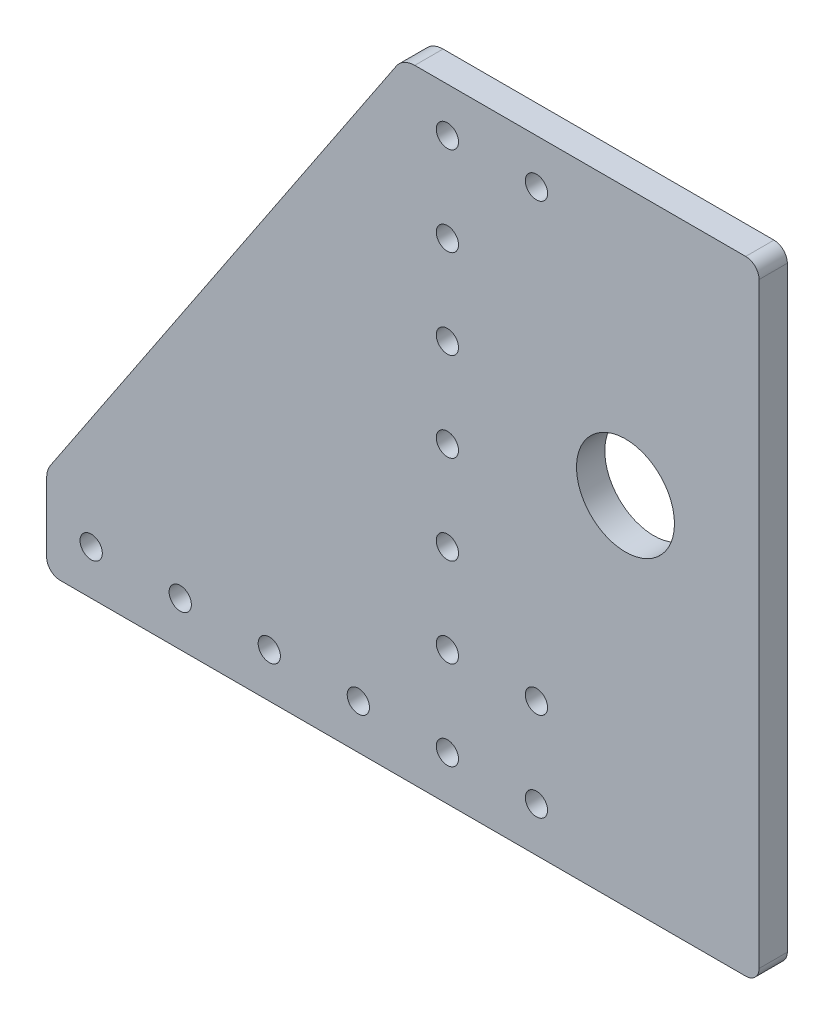
ISO-10303-21;
HEADER;
FILE_DESCRIPTION(('STEP AP214'),'2;1');
FILE_NAME('part.step','',(''),(''),'','','');
FILE_SCHEMA(('AUTOMOTIVE_DESIGN { 1 0 10303 214 1 1 1 1 }'));
ENDSEC;
DATA;
#1=APPLICATION_CONTEXT('core data for automotive mechanical design processes');
#2=APPLICATION_PROTOCOL_DEFINITION('international standard','automotive_design',2000,#1);
#3=PRODUCT_CONTEXT('',#1,'mechanical');
#4=PRODUCT('Part','Part','',(#3));
#5=PRODUCT_RELATED_PRODUCT_CATEGORY('part','',(#4));
#6=PRODUCT_DEFINITION_FORMATION('','',#4);
#7=PRODUCT_DEFINITION_CONTEXT('part definition',#1,'design');
#8=PRODUCT_DEFINITION('design','',#6,#7);
#9=PRODUCT_DEFINITION_SHAPE('','',#8);
#10=(LENGTH_UNIT() NAMED_UNIT(*) SI_UNIT(.MILLI.,.METRE.));
#11=(NAMED_UNIT(*) PLANE_ANGLE_UNIT() SI_UNIT($,.RADIAN.));
#12=(NAMED_UNIT(*) SI_UNIT($,.STERADIAN.) SOLID_ANGLE_UNIT());
#13=UNCERTAINTY_MEASURE_WITH_UNIT(LENGTH_MEASURE(1.E-05),#10,'distance_accuracy_value','');
#14=(GEOMETRIC_REPRESENTATION_CONTEXT(3) GLOBAL_UNCERTAINTY_ASSIGNED_CONTEXT((#13)) GLOBAL_UNIT_ASSIGNED_CONTEXT((#10,
#11,#12)) REPRESENTATION_CONTEXT('',''));
#15=CARTESIAN_POINT('',(0.,0.,0.));
#16=DIRECTION('',(0.,0.,1.));
#17=DIRECTION('',(1.,0.,0.));
#18=AXIS2_PLACEMENT_3D('',#15,#16,#17);
#19=CARTESIAN_POINT('',(0.,0.,6.35));
#20=DIRECTION('',(0.,0.,1.));
#21=DIRECTION('',(1.,0.,0.));
#22=AXIS2_PLACEMENT_3D('',#19,#20,#21);
#23=PLANE('',#22);
#24=CARTESIAN_POINT('',(-110.,-68.1751824817524,6.35));
#25=DIRECTION('',(0.,0.,1.));
#26=DIRECTION('',(1.,0.,0.));
#27=AXIS2_PLACEMENT_3D('',#24,#25,#26);
#28=CIRCLE('',#27,2.50000000000001);
#29=CARTESIAN_POINT('',(-107.5,-68.1751824817524,6.35));
#30=VERTEX_POINT('',#29);
#31=EDGE_CURVE('E270',#30,#30,#28,.T.);
#32=ORIENTED_EDGE('',*,*,#31,.F.);
#33=EDGE_LOOP('',(#32));
#34=FACE_BOUND('',#33,.T.);
#35=CARTESIAN_POINT('',(-70.,-68.1751824817521,6.35));
#36=DIRECTION('',(0.,0.,1.));
#37=DIRECTION('',(1.,0.,0.));
#38=AXIS2_PLACEMENT_3D('',#35,#36,#37);
#39=CIRCLE('',#38,2.50000000000002);
#40=CARTESIAN_POINT('',(-67.5,-68.1751824817521,6.35));
#41=VERTEX_POINT('',#40);
#42=EDGE_CURVE('E258',#41,#41,#39,.T.);
#43=ORIENTED_EDGE('',*,*,#42,.F.);
#44=EDGE_LOOP('',(#43));
#45=FACE_BOUND('',#44,.T.);
#46=CARTESIAN_POINT('',(-30.,-68.1751824817518,6.35));
#47=DIRECTION('',(0.,0.,1.));
#48=DIRECTION('',(1.,0.,0.));
#49=AXIS2_PLACEMENT_3D('',#46,#47,#48);
#50=CIRCLE('',#49,2.50000000000001);
#51=CARTESIAN_POINT('',(-27.5,-68.1751824817518,6.35));
#52=VERTEX_POINT('',#51);
#53=EDGE_CURVE('E246',#52,#52,#50,.T.);
#54=ORIENTED_EDGE('',*,*,#53,.F.);
#55=EDGE_LOOP('',(#54));
#56=FACE_BOUND('',#55,.T.);
#57=CARTESIAN_POINT('',(-30.0000000000003,51.8248175182482,6.35));
#58=DIRECTION('',(0.,0.,1.));
#59=DIRECTION('',(1.,0.,0.));
#60=AXIS2_PLACEMENT_3D('',#57,#58,#59);
#61=CIRCLE('',#60,2.5);
#62=CARTESIAN_POINT('',(-27.5000000000003,51.8248175182482,6.35));
#63=VERTEX_POINT('',#62);
#64=EDGE_CURVE('E234',#63,#63,#61,.T.);
#65=ORIENTED_EDGE('',*,*,#64,.F.);
#66=EDGE_LOOP('',(#65));
#67=FACE_BOUND('',#66,.T.);
#68=CARTESIAN_POINT('',(-50.0000000000003,51.8248175182482,6.35));
#69=DIRECTION('',(0.,0.,1.));
#70=DIRECTION('',(1.,0.,0.));
#71=AXIS2_PLACEMENT_3D('',#68,#69,#70);
#72=CIRCLE('',#71,2.5);
#73=CARTESIAN_POINT('',(-47.5000000000003,51.8248175182482,6.35));
#74=VERTEX_POINT('',#73);
#75=EDGE_CURVE('E222',#74,#74,#72,.T.);
#76=ORIENTED_EDGE('',*,*,#75,.F.);
#77=EDGE_LOOP('',(#76));
#78=FACE_BOUND('',#77,.T.);
#79=CARTESIAN_POINT('',(-50.0000000000002,11.8248175182482,6.35));
#80=DIRECTION('',(0.,0.,1.));
#81=DIRECTION('',(1.,0.,0.));
#82=AXIS2_PLACEMENT_3D('',#79,#80,#81);
#83=CIRCLE('',#82,2.5);
#84=CARTESIAN_POINT('',(-47.5000000000002,11.8248175182482,6.35));
#85=VERTEX_POINT('',#84);
#86=EDGE_CURVE('E210',#85,#85,#83,.T.);
#87=ORIENTED_EDGE('',*,*,#86,.F.);
#88=EDGE_LOOP('',(#87));
#89=FACE_BOUND('',#88,.T.);
#90=CARTESIAN_POINT('',(-50.,-28.1751824817518,6.35));
#91=DIRECTION('',(0.,0.,1.));
#92=DIRECTION('',(1.,0.,0.));
#93=AXIS2_PLACEMENT_3D('',#90,#91,#92);
#94=CIRCLE('',#93,2.5);
#95=CARTESIAN_POINT('',(-47.5,-28.1751824817518,6.35));
#96=VERTEX_POINT('',#95);
#97=EDGE_CURVE('E198',#96,#96,#94,.T.);
#98=ORIENTED_EDGE('',*,*,#97,.F.);
#99=EDGE_LOOP('',(#98));
#100=FACE_BOUND('',#99,.T.);
#101=DIRECTION('',(1.,0.,0.));
#102=VECTOR('',#101,1.);
#103=CARTESIAN_POINT('',(-140.,-78.1751824817518,6.35));
#104=LINE('',#103,#102);
#105=CARTESIAN_POINT('',(-137.,-78.1751824817518,6.35));
#106=VERTEX_POINT('',#105);
#107=CARTESIAN_POINT('',(17.,-78.1751824817518,6.35));
#108=VERTEX_POINT('',#107);
#109=EDGE_CURVE('E126',#106,#108,#104,.T.);
#110=ORIENTED_EDGE('',*,*,#109,.T.);
#111=CARTESIAN_POINT('',(17.,-75.1751824817518,6.35));
#112=DIRECTION('',(0.,0.,1.));
#113=DIRECTION('',(1.,0.,0.));
#114=AXIS2_PLACEMENT_3D('',#111,#112,#113);
#115=CIRCLE('',#114,3.);
#116=CARTESIAN_POINT('',(20.,-75.1751824817518,6.35));
#117=VERTEX_POINT('',#116);
#118=EDGE_CURVE('E173',#108,#117,#115,.T.);
#119=ORIENTED_EDGE('',*,*,#118,.T.);
#120=DIRECTION('',(0.,1.,0.));
#121=VECTOR('',#120,1.);
#122=CARTESIAN_POINT('',(20.,-78.1751824817518,6.35));
#123=LINE('',#122,#121);
#124=CARTESIAN_POINT('',(20.,58.8248175182482,6.35));
#125=VERTEX_POINT('',#124);
#126=EDGE_CURVE('E137',#117,#125,#123,.T.);
#127=ORIENTED_EDGE('',*,*,#126,.T.);
#128=CARTESIAN_POINT('',(17.,58.8248175182482,6.35));
#129=DIRECTION('',(0.,0.,1.));
#130=DIRECTION('',(1.,0.,0.));
#131=AXIS2_PLACEMENT_3D('',#128,#129,#130);
#132=CIRCLE('',#131,3.);
#133=CARTESIAN_POINT('',(17.,61.8248175182482,6.35));
#134=VERTEX_POINT('',#133);
#135=EDGE_CURVE('E47',#125,#134,#132,.T.);
#136=ORIENTED_EDGE('',*,*,#135,.T.);
#137=DIRECTION('',(-1.,0.,0.));
#138=VECTOR('',#137,1.);
#139=CARTESIAN_POINT('',(20.,61.8248175182482,6.35));
#140=LINE('',#139,#138);
#141=CARTESIAN_POINT('',(-57.32408120756,61.8248175182482,6.35));
#142=VERTEX_POINT('',#141);
#143=EDGE_CURVE('E179',#134,#142,#140,.T.);
#144=ORIENTED_EDGE('',*,*,#143,.T.);
#145=CARTESIAN_POINT('',(-57.32408120756,56.8248175182482,6.35));
#146=DIRECTION('',(0.,0.,1.));
#147=DIRECTION('',(1.,0.,0.));
#148=AXIS2_PLACEMENT_3D('',#145,#146,#147);
#149=CIRCLE('',#148,5.);
#150=CARTESIAN_POINT('',(-61.4843326792492,59.5983184993743,6.35));
#151=VERTEX_POINT('',#150);
#152=EDGE_CURVE('E148',#142,#151,#149,.T.);
#153=ORIENTED_EDGE('',*,*,#152,.T.);
#154=DIRECTION('',(-0.554700196225227,-0.832050294337845,0.));
#155=VECTOR('',#154,1.);
#156=CARTESIAN_POINT('',(-140.,-58.1751824817518,6.35));
#157=LINE('',#156,#155);
#158=CARTESIAN_POINT('',(-139.160251471689,-56.9155596892856,6.35));
#159=VERTEX_POINT('',#158);
#160=EDGE_CURVE('E190',#151,#159,#157,.T.);
#161=ORIENTED_EDGE('',*,*,#160,.T.);
#162=CARTESIAN_POINT('',(-135.,-59.6890606704118,6.35));
#163=DIRECTION('',(0.,0.,1.));
#164=DIRECTION('',(1.,0.,0.));
#165=AXIS2_PLACEMENT_3D('',#162,#163,#164);
#166=CIRCLE('',#165,5.);
#167=CARTESIAN_POINT('',(-140.,-59.6890606704118,6.35));
#168=VERTEX_POINT('',#167);
#169=EDGE_CURVE('E150',#159,#168,#166,.T.);
#170=ORIENTED_EDGE('',*,*,#169,.T.);
#171=DIRECTION('',(0.,-1.,0.));
#172=VECTOR('',#171,1.);
#173=CARTESIAN_POINT('',(-140.,-78.1751824817518,6.35));
#174=LINE('',#173,#172);
#175=CARTESIAN_POINT('',(-140.,-75.1751824817518,6.35));
#176=VERTEX_POINT('',#175);
#177=EDGE_CURVE('E125',#168,#176,#174,.T.);
#178=ORIENTED_EDGE('',*,*,#177,.T.);
#179=CARTESIAN_POINT('',(-137.,-75.1751824817518,6.35));
#180=DIRECTION('',(0.,0.,1.));
#181=DIRECTION('',(1.,0.,0.));
#182=AXIS2_PLACEMENT_3D('',#179,#180,#181);
#183=CIRCLE('',#182,3.);
#184=EDGE_CURVE('E170',#176,#106,#183,.T.);
#185=ORIENTED_EDGE('',*,*,#184,.T.);
#186=EDGE_LOOP('',(#110,#119,#127,#136,#144,#153,#161,#170,#178,#185));
#187=FACE_BOUND('',#186,.T.);
#188=CARTESIAN_POINT('',(-50.,-48.1751824817518,6.35));
#189=DIRECTION('',(0.,0.,1.));
#190=DIRECTION('',(1.,0.,0.));
#191=AXIS2_PLACEMENT_3D('',#188,#189,#190);
#192=CIRCLE('',#191,2.5);
#193=CARTESIAN_POINT('',(-47.5,-48.1751824817518,6.35));
#194=VERTEX_POINT('',#193);
#195=EDGE_CURVE('E184',#194,#194,#192,.T.);
#196=ORIENTED_EDGE('',*,*,#195,.F.);
#197=EDGE_LOOP('',(#196));
#198=FACE_BOUND('',#197,.T.);
#199=CARTESIAN_POINT('',(-50.0000000000001,-8.17518248175182,6.35));
#200=DIRECTION('',(0.,0.,1.));
#201=DIRECTION('',(1.,0.,0.));
#202=AXIS2_PLACEMENT_3D('',#199,#200,#201);
#203=CIRCLE('',#202,2.5);
#204=CARTESIAN_POINT('',(-47.5000000000001,-8.17518248175182,6.35));
#205=VERTEX_POINT('',#204);
#206=EDGE_CURVE('E204',#205,#205,#203,.T.);
#207=ORIENTED_EDGE('',*,*,#206,.F.);
#208=EDGE_LOOP('',(#207));
#209=FACE_BOUND('',#208,.T.);
#210=CARTESIAN_POINT('',(-50.0000000000003,31.8248175182482,6.35));
#211=DIRECTION('',(0.,0.,1.));
#212=DIRECTION('',(1.,0.,0.));
#213=AXIS2_PLACEMENT_3D('',#210,#211,#212);
#214=CIRCLE('',#213,2.5);
#215=CARTESIAN_POINT('',(-47.5000000000002,31.8248175182482,6.35));
#216=VERTEX_POINT('',#215);
#217=EDGE_CURVE('E216',#216,#216,#214,.T.);
#218=ORIENTED_EDGE('',*,*,#217,.F.);
#219=EDGE_LOOP('',(#218));
#220=FACE_BOUND('',#219,.T.);
#221=CARTESIAN_POINT('',(-30.,-48.1751824817518,6.35));
#222=DIRECTION('',(0.,0.,1.));
#223=DIRECTION('',(1.,0.,0.));
#224=AXIS2_PLACEMENT_3D('',#221,#222,#223);
#225=CIRCLE('',#224,2.5);
#226=CARTESIAN_POINT('',(-27.5,-48.1751824817518,6.35));
#227=VERTEX_POINT('',#226);
#228=EDGE_CURVE('E228',#227,#227,#225,.T.);
#229=ORIENTED_EDGE('',*,*,#228,.F.);
#230=EDGE_LOOP('',(#229));
#231=FACE_BOUND('',#230,.T.);
#232=CARTESIAN_POINT('',(-9.99999999999999,1.82481751824847,6.35));
#233=DIRECTION('',(0.,0.,1.));
#234=DIRECTION('',(1.,0.,0.));
#235=AXIS2_PLACEMENT_3D('',#232,#233,#234);
#236=CIRCLE('',#235,10.9999999999999);
#237=CARTESIAN_POINT('',(0.999999999999925,1.82481751824847,6.35));
#238=VERTEX_POINT('',#237);
#239=EDGE_CURVE('E240',#238,#238,#236,.T.);
#240=ORIENTED_EDGE('',*,*,#239,.F.);
#241=EDGE_LOOP('',(#240));
#242=FACE_BOUND('',#241,.T.);
#243=CARTESIAN_POINT('',(-50.,-68.1751824817519,6.35));
#244=DIRECTION('',(0.,0.,1.));
#245=DIRECTION('',(1.,0.,0.));
#246=AXIS2_PLACEMENT_3D('',#243,#244,#245);
#247=CIRCLE('',#246,2.50000000000001);
#248=CARTESIAN_POINT('',(-47.5,-68.1751824817519,6.35));
#249=VERTEX_POINT('',#248);
#250=EDGE_CURVE('E252',#249,#249,#247,.T.);
#251=ORIENTED_EDGE('',*,*,#250,.F.);
#252=EDGE_LOOP('',(#251));
#253=FACE_BOUND('',#252,.T.);
#254=CARTESIAN_POINT('',(-90.,-68.1751824817522,6.35));
#255=DIRECTION('',(0.,0.,1.));
#256=DIRECTION('',(1.,0.,0.));
#257=AXIS2_PLACEMENT_3D('',#254,#255,#256);
#258=CIRCLE('',#257,2.50000000000001);
#259=CARTESIAN_POINT('',(-87.5,-68.1751824817522,6.35));
#260=VERTEX_POINT('',#259);
#261=EDGE_CURVE('E264',#260,#260,#258,.T.);
#262=ORIENTED_EDGE('',*,*,#261,.F.);
#263=EDGE_LOOP('',(#262));
#264=FACE_BOUND('',#263,.T.);
#265=CARTESIAN_POINT('',(-130.,-68.1751824817525,6.35));
#266=DIRECTION('',(0.,0.,1.));
#267=DIRECTION('',(1.,0.,0.));
#268=AXIS2_PLACEMENT_3D('',#265,#266,#267);
#269=CIRCLE('',#268,2.5);
#270=CARTESIAN_POINT('',(-127.5,-68.1751824817525,6.35));
#271=VERTEX_POINT('',#270);
#272=EDGE_CURVE('E276',#271,#271,#269,.T.);
#273=ORIENTED_EDGE('',*,*,#272,.F.);
#274=EDGE_LOOP('',(#273));
#275=FACE_BOUND('',#274,.T.);
#276=ADVANCED_FACE('F32',(#34,#45,#56,#67,#78,#89,#100,#187,#198,#209,#220,#231,#242,#253,#264,
#275),#23,.T.);
#277=CARTESIAN_POINT('',(0.,0.,0.));
#278=DIRECTION('',(0.,0.,1.));
#279=DIRECTION('',(1.,0.,0.));
#280=AXIS2_PLACEMENT_3D('',#277,#278,#279);
#281=PLANE('',#280);
#282=DIRECTION('',(0.,1.,0.));
#283=VECTOR('',#282,1.);
#284=CARTESIAN_POINT('',(20.,-78.1751824817518,0.));
#285=LINE('',#284,#283);
#286=CARTESIAN_POINT('',(20.,-75.1751824817518,0.));
#287=VERTEX_POINT('',#286);
#288=CARTESIAN_POINT('',(20.,58.8248175182482,0.));
#289=VERTEX_POINT('',#288);
#290=EDGE_CURVE('E183',#287,#289,#285,.T.);
#291=ORIENTED_EDGE('',*,*,#290,.F.);
#292=CARTESIAN_POINT('',(17.,-75.1751824817518,0.));
#293=DIRECTION('',(0.,0.,1.));
#294=DIRECTION('',(1.,0.,0.));
#295=AXIS2_PLACEMENT_3D('',#292,#293,#294);
#296=CIRCLE('',#295,3.);
#297=CARTESIAN_POINT('',(17.,-78.1751824817518,0.));
#298=VERTEX_POINT('',#297);
#299=EDGE_CURVE('E163',#287,#298,#296,.F.);
#300=ORIENTED_EDGE('',*,*,#299,.T.);
#301=DIRECTION('',(1.,0.,0.));
#302=VECTOR('',#301,1.);
#303=CARTESIAN_POINT('',(-140.,-78.1751824817518,0.));
#304=LINE('',#303,#302);
#305=CARTESIAN_POINT('',(-137.,-78.1751824817518,0.));
#306=VERTEX_POINT('',#305);
#307=EDGE_CURVE('E133',#306,#298,#304,.T.);
#308=ORIENTED_EDGE('',*,*,#307,.F.);
#309=CARTESIAN_POINT('',(-137.,-75.1751824817518,0.));
#310=DIRECTION('',(0.,0.,1.));
#311=DIRECTION('',(1.,0.,0.));
#312=AXIS2_PLACEMENT_3D('',#309,#310,#311);
#313=CIRCLE('',#312,3.);
#314=CARTESIAN_POINT('',(-140.,-75.1751824817518,0.));
#315=VERTEX_POINT('',#314);
#316=EDGE_CURVE('E132',#306,#315,#313,.F.);
#317=ORIENTED_EDGE('',*,*,#316,.T.);
#318=DIRECTION('',(0.,-1.,0.));
#319=VECTOR('',#318,1.);
#320=CARTESIAN_POINT('',(-140.,-78.1751824817518,0.));
#321=LINE('',#320,#319);
#322=CARTESIAN_POINT('',(-140.,-59.6890606704118,0.));
#323=VERTEX_POINT('',#322);
#324=EDGE_CURVE('E124',#323,#315,#321,.T.);
#325=ORIENTED_EDGE('',*,*,#324,.F.);
#326=CARTESIAN_POINT('',(-135.,-59.6890606704118,0.));
#327=DIRECTION('',(0.,0.,1.));
#328=DIRECTION('',(1.,0.,0.));
#329=AXIS2_PLACEMENT_3D('',#326,#327,#328);
#330=CIRCLE('',#329,5.);
#331=CARTESIAN_POINT('',(-139.160251471689,-56.9155596892856,0.));
#332=VERTEX_POINT('',#331);
#333=EDGE_CURVE('E110',#323,#332,#330,.F.);
#334=ORIENTED_EDGE('',*,*,#333,.T.);
#335=DIRECTION('',(-0.554700196225227,-0.832050294337845,0.));
#336=VECTOR('',#335,1.);
#337=CARTESIAN_POINT('',(-140.,-58.1751824817518,0.));
#338=LINE('',#337,#336);
#339=CARTESIAN_POINT('',(-61.4843326792492,59.5983184993743,0.));
#340=VERTEX_POINT('',#339);
#341=EDGE_CURVE('E134',#340,#332,#338,.T.);
#342=ORIENTED_EDGE('',*,*,#341,.F.);
#343=CARTESIAN_POINT('',(-57.32408120756,56.8248175182482,0.));
#344=DIRECTION('',(0.,0.,1.));
#345=DIRECTION('',(1.,0.,0.));
#346=AXIS2_PLACEMENT_3D('',#343,#344,#345);
#347=CIRCLE('',#346,5.);
#348=CARTESIAN_POINT('',(-57.32408120756,61.8248175182482,0.));
#349=VERTEX_POINT('',#348);
#350=EDGE_CURVE('E121',#340,#349,#347,.F.);
#351=ORIENTED_EDGE('',*,*,#350,.T.);
#352=DIRECTION('',(-1.,0.,0.));
#353=VECTOR('',#352,1.);
#354=CARTESIAN_POINT('',(20.,61.8248175182482,0.));
#355=LINE('',#354,#353);
#356=CARTESIAN_POINT('',(17.,61.8248175182482,0.));
#357=VERTEX_POINT('',#356);
#358=EDGE_CURVE('E139',#357,#349,#355,.T.);
#359=ORIENTED_EDGE('',*,*,#358,.F.);
#360=CARTESIAN_POINT('',(17.,58.8248175182482,0.));
#361=DIRECTION('',(0.,0.,1.));
#362=DIRECTION('',(1.,0.,0.));
#363=AXIS2_PLACEMENT_3D('',#360,#361,#362);
#364=CIRCLE('',#363,3.);
#365=EDGE_CURVE('E161',#357,#289,#364,.F.);
#366=ORIENTED_EDGE('',*,*,#365,.T.);
#367=EDGE_LOOP('',(#291,#300,#308,#317,#325,#334,#342,#351,#359,#366));
#368=FACE_BOUND('',#367,.T.);
#369=CARTESIAN_POINT('',(-50.,-48.1751824817518,0.));
#370=DIRECTION('',(0.,0.,1.));
#371=DIRECTION('',(1.,0.,0.));
#372=AXIS2_PLACEMENT_3D('',#369,#370,#371);
#373=CIRCLE('',#372,2.5);
#374=CARTESIAN_POINT('',(-47.5,-48.1751824817518,0.));
#375=VERTEX_POINT('',#374);
#376=EDGE_CURVE('E195',#375,#375,#373,.T.);
#377=ORIENTED_EDGE('',*,*,#376,.T.);
#378=EDGE_LOOP('',(#377));
#379=FACE_BOUND('',#378,.T.);
#380=CARTESIAN_POINT('',(-50.,-28.1751824817518,0.));
#381=DIRECTION('',(0.,0.,1.));
#382=DIRECTION('',(1.,0.,0.));
#383=AXIS2_PLACEMENT_3D('',#380,#381,#382);
#384=CIRCLE('',#383,2.5);
#385=CARTESIAN_POINT('',(-47.5,-28.1751824817518,0.));
#386=VERTEX_POINT('',#385);
#387=EDGE_CURVE('E201',#386,#386,#384,.T.);
#388=ORIENTED_EDGE('',*,*,#387,.T.);
#389=EDGE_LOOP('',(#388));
#390=FACE_BOUND('',#389,.T.);
#391=CARTESIAN_POINT('',(-50.0000000000001,-8.17518248175182,0.));
#392=DIRECTION('',(0.,0.,1.));
#393=DIRECTION('',(1.,0.,0.));
#394=AXIS2_PLACEMENT_3D('',#391,#392,#393);
#395=CIRCLE('',#394,2.5);
#396=CARTESIAN_POINT('',(-47.5000000000001,-8.17518248175182,0.));
#397=VERTEX_POINT('',#396);
#398=EDGE_CURVE('E207',#397,#397,#395,.T.);
#399=ORIENTED_EDGE('',*,*,#398,.T.);
#400=EDGE_LOOP('',(#399));
#401=FACE_BOUND('',#400,.T.);
#402=CARTESIAN_POINT('',(-50.0000000000002,11.8248175182482,0.));
#403=DIRECTION('',(0.,0.,1.));
#404=DIRECTION('',(1.,0.,0.));
#405=AXIS2_PLACEMENT_3D('',#402,#403,#404);
#406=CIRCLE('',#405,2.5);
#407=CARTESIAN_POINT('',(-47.5000000000002,11.8248175182482,0.));
#408=VERTEX_POINT('',#407);
#409=EDGE_CURVE('E213',#408,#408,#406,.T.);
#410=ORIENTED_EDGE('',*,*,#409,.T.);
#411=EDGE_LOOP('',(#410));
#412=FACE_BOUND('',#411,.T.);
#413=CARTESIAN_POINT('',(-50.0000000000003,31.8248175182482,0.));
#414=DIRECTION('',(0.,0.,1.));
#415=DIRECTION('',(1.,0.,0.));
#416=AXIS2_PLACEMENT_3D('',#413,#414,#415);
#417=CIRCLE('',#416,2.5);
#418=CARTESIAN_POINT('',(-47.5000000000002,31.8248175182482,0.));
#419=VERTEX_POINT('',#418);
#420=EDGE_CURVE('E219',#419,#419,#417,.T.);
#421=ORIENTED_EDGE('',*,*,#420,.T.);
#422=EDGE_LOOP('',(#421));
#423=FACE_BOUND('',#422,.T.);
#424=CARTESIAN_POINT('',(-50.0000000000003,51.8248175182482,0.));
#425=DIRECTION('',(0.,0.,1.));
#426=DIRECTION('',(1.,0.,0.));
#427=AXIS2_PLACEMENT_3D('',#424,#425,#426);
#428=CIRCLE('',#427,2.5);
#429=CARTESIAN_POINT('',(-47.5000000000003,51.8248175182482,0.));
#430=VERTEX_POINT('',#429);
#431=EDGE_CURVE('E225',#430,#430,#428,.T.);
#432=ORIENTED_EDGE('',*,*,#431,.T.);
#433=EDGE_LOOP('',(#432));
#434=FACE_BOUND('',#433,.T.);
#435=CARTESIAN_POINT('',(-30.,-48.1751824817518,0.));
#436=DIRECTION('',(0.,0.,1.));
#437=DIRECTION('',(1.,0.,0.));
#438=AXIS2_PLACEMENT_3D('',#435,#436,#437);
#439=CIRCLE('',#438,2.5);
#440=CARTESIAN_POINT('',(-27.5,-48.1751824817518,0.));
#441=VERTEX_POINT('',#440);
#442=EDGE_CURVE('E231',#441,#441,#439,.T.);
#443=ORIENTED_EDGE('',*,*,#442,.T.);
#444=EDGE_LOOP('',(#443));
#445=FACE_BOUND('',#444,.T.);
#446=CARTESIAN_POINT('',(-30.0000000000003,51.8248175182482,0.));
#447=DIRECTION('',(0.,0.,1.));
#448=DIRECTION('',(1.,0.,0.));
#449=AXIS2_PLACEMENT_3D('',#446,#447,#448);
#450=CIRCLE('',#449,2.5);
#451=CARTESIAN_POINT('',(-27.5000000000003,51.8248175182482,0.));
#452=VERTEX_POINT('',#451);
#453=EDGE_CURVE('E237',#452,#452,#450,.T.);
#454=ORIENTED_EDGE('',*,*,#453,.T.);
#455=EDGE_LOOP('',(#454));
#456=FACE_BOUND('',#455,.T.);
#457=CARTESIAN_POINT('',(-9.99999999999999,1.82481751824847,0.));
#458=DIRECTION('',(0.,0.,1.));
#459=DIRECTION('',(1.,0.,0.));
#460=AXIS2_PLACEMENT_3D('',#457,#458,#459);
#461=CIRCLE('',#460,10.9999999999999);
#462=CARTESIAN_POINT('',(0.999999999999925,1.82481751824847,0.));
#463=VERTEX_POINT('',#462);
#464=EDGE_CURVE('E243',#463,#463,#461,.T.);
#465=ORIENTED_EDGE('',*,*,#464,.T.);
#466=EDGE_LOOP('',(#465));
#467=FACE_BOUND('',#466,.T.);
#468=CARTESIAN_POINT('',(-30.,-68.1751824817518,0.));
#469=DIRECTION('',(0.,0.,1.));
#470=DIRECTION('',(1.,0.,0.));
#471=AXIS2_PLACEMENT_3D('',#468,#469,#470);
#472=CIRCLE('',#471,2.50000000000001);
#473=CARTESIAN_POINT('',(-27.5,-68.1751824817518,0.));
#474=VERTEX_POINT('',#473);
#475=EDGE_CURVE('E249',#474,#474,#472,.T.);
#476=ORIENTED_EDGE('',*,*,#475,.T.);
#477=EDGE_LOOP('',(#476));
#478=FACE_BOUND('',#477,.T.);
#479=CARTESIAN_POINT('',(-50.,-68.1751824817519,0.));
#480=DIRECTION('',(0.,0.,1.));
#481=DIRECTION('',(1.,0.,0.));
#482=AXIS2_PLACEMENT_3D('',#479,#480,#481);
#483=CIRCLE('',#482,2.50000000000001);
#484=CARTESIAN_POINT('',(-47.5,-68.1751824817519,0.));
#485=VERTEX_POINT('',#484);
#486=EDGE_CURVE('E255',#485,#485,#483,.T.);
#487=ORIENTED_EDGE('',*,*,#486,.T.);
#488=EDGE_LOOP('',(#487));
#489=FACE_BOUND('',#488,.T.);
#490=CARTESIAN_POINT('',(-70.,-68.1751824817521,0.));
#491=DIRECTION('',(0.,0.,1.));
#492=DIRECTION('',(1.,0.,0.));
#493=AXIS2_PLACEMENT_3D('',#490,#491,#492);
#494=CIRCLE('',#493,2.50000000000002);
#495=CARTESIAN_POINT('',(-67.5,-68.1751824817521,0.));
#496=VERTEX_POINT('',#495);
#497=EDGE_CURVE('E261',#496,#496,#494,.T.);
#498=ORIENTED_EDGE('',*,*,#497,.T.);
#499=EDGE_LOOP('',(#498));
#500=FACE_BOUND('',#499,.T.);
#501=CARTESIAN_POINT('',(-90.,-68.1751824817522,0.));
#502=DIRECTION('',(0.,0.,1.));
#503=DIRECTION('',(1.,0.,0.));
#504=AXIS2_PLACEMENT_3D('',#501,#502,#503);
#505=CIRCLE('',#504,2.50000000000001);
#506=CARTESIAN_POINT('',(-87.5,-68.1751824817522,0.));
#507=VERTEX_POINT('',#506);
#508=EDGE_CURVE('E267',#507,#507,#505,.T.);
#509=ORIENTED_EDGE('',*,*,#508,.T.);
#510=EDGE_LOOP('',(#509));
#511=FACE_BOUND('',#510,.T.);
#512=CARTESIAN_POINT('',(-110.,-68.1751824817524,0.));
#513=DIRECTION('',(0.,0.,1.));
#514=DIRECTION('',(1.,0.,0.));
#515=AXIS2_PLACEMENT_3D('',#512,#513,#514);
#516=CIRCLE('',#515,2.50000000000001);
#517=CARTESIAN_POINT('',(-107.5,-68.1751824817524,0.));
#518=VERTEX_POINT('',#517);
#519=EDGE_CURVE('E273',#518,#518,#516,.T.);
#520=ORIENTED_EDGE('',*,*,#519,.T.);
#521=EDGE_LOOP('',(#520));
#522=FACE_BOUND('',#521,.T.);
#523=CARTESIAN_POINT('',(-130.,-68.1751824817525,0.));
#524=DIRECTION('',(0.,0.,1.));
#525=DIRECTION('',(1.,0.,0.));
#526=AXIS2_PLACEMENT_3D('',#523,#524,#525);
#527=CIRCLE('',#526,2.5);
#528=CARTESIAN_POINT('',(-127.5,-68.1751824817525,0.));
#529=VERTEX_POINT('',#528);
#530=EDGE_CURVE('E279',#529,#529,#527,.T.);
#531=ORIENTED_EDGE('',*,*,#530,.T.);
#532=EDGE_LOOP('',(#531));
#533=FACE_BOUND('',#532,.T.);
#534=ADVANCED_FACE('F129',(#368,#379,#390,#401,#412,#423,#434,#445,#456,#467,#478,#489,#500,
#511,#522,#533),#281,.F.);
#535=CARTESIAN_POINT('',(20.,-78.1751824817518,6.35));
#536=DIRECTION('',(-1.,0.,0.));
#537=DIRECTION('',(0.,0.,1.));
#538=AXIS2_PLACEMENT_3D('',#535,#536,#537);
#539=PLANE('',#538);
#540=ORIENTED_EDGE('',*,*,#126,.F.);
#541=DIRECTION('',(0.,0.,-1.));
#542=VECTOR('',#541,1.);
#543=CARTESIAN_POINT('',(20.,-75.1751824817518,6.35));
#544=LINE('',#543,#542);
#545=EDGE_CURVE('E157',#117,#287,#544,.T.);
#546=ORIENTED_EDGE('',*,*,#545,.T.);
#547=ORIENTED_EDGE('',*,*,#290,.T.);
#548=DIRECTION('',(0.,0.,-1.));
#549=VECTOR('',#548,1.);
#550=CARTESIAN_POINT('',(20.,58.8248175182482,6.35));
#551=LINE('',#550,#549);
#552=EDGE_CURVE('E155',#289,#125,#551,.F.);
#553=ORIENTED_EDGE('',*,*,#552,.T.);
#554=EDGE_LOOP('',(#540,#546,#547,#553));
#555=FACE_BOUND('',#554,.T.);
#556=ADVANCED_FACE('F294',(#555),#539,.F.);
#557=CARTESIAN_POINT('',(20.,61.8248175182482,6.35));
#558=DIRECTION('',(0.,-1.,0.));
#559=DIRECTION('',(1.,0.,0.));
#560=AXIS2_PLACEMENT_3D('',#557,#558,#559);
#561=PLANE('',#560);
#562=ORIENTED_EDGE('',*,*,#143,.F.);
#563=DIRECTION('',(0.,0.,-1.));
#564=VECTOR('',#563,1.);
#565=CARTESIAN_POINT('',(17.,61.8248175182482,6.35));
#566=LINE('',#565,#564);
#567=EDGE_CURVE('E40',#134,#357,#566,.T.);
#568=ORIENTED_EDGE('',*,*,#567,.T.);
#569=ORIENTED_EDGE('',*,*,#358,.T.);
#570=DIRECTION('',(0.,0.,-1.));
#571=VECTOR('',#570,1.);
#572=CARTESIAN_POINT('',(-57.32408120756,61.8248175182482,6.35));
#573=LINE('',#572,#571);
#574=EDGE_CURVE('E152',#349,#142,#573,.F.);
#575=ORIENTED_EDGE('',*,*,#574,.T.);
#576=EDGE_LOOP('',(#562,#568,#569,#575));
#577=FACE_BOUND('',#576,.T.);
#578=ADVANCED_FACE('F178',(#577),#561,.F.);
#579=CARTESIAN_POINT('',(-140.,-58.1751824817518,6.35));
#580=DIRECTION('',(0.832050294337845,-0.554700196225227,0.));
#581=DIRECTION('',(0.554700196225227,0.832050294337845,0.));
#582=AXIS2_PLACEMENT_3D('',#579,#580,#581);
#583=PLANE('',#582);
#584=ORIENTED_EDGE('',*,*,#341,.T.);
#585=DIRECTION('',(0.,0.,-1.));
#586=VECTOR('',#585,1.);
#587=CARTESIAN_POINT('',(-139.160251471689,-56.9155596892856,6.35));
#588=LINE('',#587,#586);
#589=EDGE_CURVE('E115',#332,#159,#588,.F.);
#590=ORIENTED_EDGE('',*,*,#589,.T.);
#591=ORIENTED_EDGE('',*,*,#160,.F.);
#592=DIRECTION('',(0.,0.,-1.));
#593=VECTOR('',#592,1.);
#594=CARTESIAN_POINT('',(-61.4843326792492,59.5983184993743,6.35));
#595=LINE('',#594,#593);
#596=EDGE_CURVE('E120',#151,#340,#595,.T.);
#597=ORIENTED_EDGE('',*,*,#596,.T.);
#598=EDGE_LOOP('',(#584,#590,#591,#597));
#599=FACE_BOUND('',#598,.T.);
#600=ADVANCED_FACE('F308',(#599),#583,.F.);
#601=CARTESIAN_POINT('',(-140.,-78.1751824817518,6.35));
#602=DIRECTION('',(1.,0.,0.));
#603=DIRECTION('',(0.,0.,-1.));
#604=AXIS2_PLACEMENT_3D('',#601,#602,#603);
#605=PLANE('',#604);
#606=ORIENTED_EDGE('',*,*,#324,.T.);
#607=DIRECTION('',(0.,0.,-1.));
#608=VECTOR('',#607,1.);
#609=CARTESIAN_POINT('',(-140.,-75.1751824817518,6.35));
#610=LINE('',#609,#608);
#611=EDGE_CURVE('E11',#315,#176,#610,.F.);
#612=ORIENTED_EDGE('',*,*,#611,.T.);
#613=ORIENTED_EDGE('',*,*,#177,.F.);
#614=DIRECTION('',(0.,0.,-1.));
#615=VECTOR('',#614,1.);
#616=CARTESIAN_POINT('',(-140.,-59.6890606704118,6.35));
#617=LINE('',#616,#615);
#618=EDGE_CURVE('E114',#168,#323,#617,.T.);
#619=ORIENTED_EDGE('',*,*,#618,.T.);
#620=EDGE_LOOP('',(#606,#612,#613,#619));
#621=FACE_BOUND('',#620,.T.);
#622=ADVANCED_FACE('F123',(#621),#605,.F.);
#623=CARTESIAN_POINT('',(-140.,-78.1751824817518,6.35));
#624=DIRECTION('',(0.,1.,0.));
#625=DIRECTION('',(0.,0.,1.));
#626=AXIS2_PLACEMENT_3D('',#623,#624,#625);
#627=PLANE('',#626);
#628=ORIENTED_EDGE('',*,*,#307,.T.);
#629=DIRECTION('',(0.,0.,-1.));
#630=VECTOR('',#629,1.);
#631=CARTESIAN_POINT('',(17.,-78.1751824817518,6.35));
#632=LINE('',#631,#630);
#633=EDGE_CURVE('E168',#298,#108,#632,.F.);
#634=ORIENTED_EDGE('',*,*,#633,.T.);
#635=ORIENTED_EDGE('',*,*,#109,.F.);
#636=DIRECTION('',(0.,0.,-1.));
#637=VECTOR('',#636,1.);
#638=CARTESIAN_POINT('',(-137.,-78.1751824817518,6.35));
#639=LINE('',#638,#637);
#640=EDGE_CURVE('E165',#106,#306,#639,.T.);
#641=ORIENTED_EDGE('',*,*,#640,.T.);
#642=EDGE_LOOP('',(#628,#634,#635,#641));
#643=FACE_BOUND('',#642,.T.);
#644=ADVANCED_FACE('F302',(#643),#627,.F.);
#645=CARTESIAN_POINT('',(-50.,-48.1751824817518,6.35));
#646=DIRECTION('',(0.,0.,-1.));
#647=DIRECTION('',(-1.,0.,0.));
#648=AXIS2_PLACEMENT_3D('',#645,#646,#647);
#649=CYLINDRICAL_SURFACE('',#648,2.5);
#650=ORIENTED_EDGE('',*,*,#195,.T.);
#651=EDGE_LOOP('',(#650));
#652=FACE_BOUND('',#651,.T.);
#653=ORIENTED_EDGE('',*,*,#376,.F.);
#654=EDGE_LOOP('',(#653));
#655=FACE_BOUND('',#654,.T.);
#656=ADVANCED_FACE('F299',(#652,#655),#649,.F.);
#657=CARTESIAN_POINT('',(-50.,-28.1751824817518,6.35));
#658=DIRECTION('',(0.,0.,-1.));
#659=DIRECTION('',(-1.,0.,0.));
#660=AXIS2_PLACEMENT_3D('',#657,#658,#659);
#661=CYLINDRICAL_SURFACE('',#660,2.5);
#662=ORIENTED_EDGE('',*,*,#97,.T.);
#663=EDGE_LOOP('',(#662));
#664=FACE_BOUND('',#663,.T.);
#665=ORIENTED_EDGE('',*,*,#387,.F.);
#666=EDGE_LOOP('',(#665));
#667=FACE_BOUND('',#666,.T.);
#668=ADVANCED_FACE('F415',(#664,#667),#661,.F.);
#669=CARTESIAN_POINT('',(-50.0000000000001,-8.17518248175182,6.35));
#670=DIRECTION('',(0.,0.,-1.));
#671=DIRECTION('',(-1.,0.,0.));
#672=AXIS2_PLACEMENT_3D('',#669,#670,#671);
#673=CYLINDRICAL_SURFACE('',#672,2.5);
#674=ORIENTED_EDGE('',*,*,#206,.T.);
#675=EDGE_LOOP('',(#674));
#676=FACE_BOUND('',#675,.T.);
#677=ORIENTED_EDGE('',*,*,#398,.F.);
#678=EDGE_LOOP('',(#677));
#679=FACE_BOUND('',#678,.T.);
#680=ADVANCED_FACE('F412',(#676,#679),#673,.F.);
#681=CARTESIAN_POINT('',(-50.0000000000002,11.8248175182482,6.35));
#682=DIRECTION('',(0.,0.,-1.));
#683=DIRECTION('',(-1.,0.,0.));
#684=AXIS2_PLACEMENT_3D('',#681,#682,#683);
#685=CYLINDRICAL_SURFACE('',#684,2.5);
#686=ORIENTED_EDGE('',*,*,#86,.T.);
#687=EDGE_LOOP('',(#686));
#688=FACE_BOUND('',#687,.T.);
#689=ORIENTED_EDGE('',*,*,#409,.F.);
#690=EDGE_LOOP('',(#689));
#691=FACE_BOUND('',#690,.T.);
#692=ADVANCED_FACE('F408',(#688,#691),#685,.F.);
#693=CARTESIAN_POINT('',(-50.0000000000003,31.8248175182482,6.35));
#694=DIRECTION('',(0.,0.,-1.));
#695=DIRECTION('',(-1.,0.,0.));
#696=AXIS2_PLACEMENT_3D('',#693,#694,#695);
#697=CYLINDRICAL_SURFACE('',#696,2.5);
#698=ORIENTED_EDGE('',*,*,#217,.T.);
#699=EDGE_LOOP('',(#698));
#700=FACE_BOUND('',#699,.T.);
#701=ORIENTED_EDGE('',*,*,#420,.F.);
#702=EDGE_LOOP('',(#701));
#703=FACE_BOUND('',#702,.T.);
#704=ADVANCED_FACE('F404',(#700,#703),#697,.F.);
#705=CARTESIAN_POINT('',(-50.0000000000003,51.8248175182482,6.35));
#706=DIRECTION('',(0.,0.,-1.));
#707=DIRECTION('',(-1.,0.,0.));
#708=AXIS2_PLACEMENT_3D('',#705,#706,#707);
#709=CYLINDRICAL_SURFACE('',#708,2.5);
#710=ORIENTED_EDGE('',*,*,#75,.T.);
#711=EDGE_LOOP('',(#710));
#712=FACE_BOUND('',#711,.T.);
#713=ORIENTED_EDGE('',*,*,#431,.F.);
#714=EDGE_LOOP('',(#713));
#715=FACE_BOUND('',#714,.T.);
#716=ADVANCED_FACE('F400',(#712,#715),#709,.F.);
#717=CARTESIAN_POINT('',(-30.,-48.1751824817518,6.35));
#718=DIRECTION('',(0.,0.,-1.));
#719=DIRECTION('',(-1.,0.,0.));
#720=AXIS2_PLACEMENT_3D('',#717,#718,#719);
#721=CYLINDRICAL_SURFACE('',#720,2.5);
#722=ORIENTED_EDGE('',*,*,#228,.T.);
#723=EDGE_LOOP('',(#722));
#724=FACE_BOUND('',#723,.T.);
#725=ORIENTED_EDGE('',*,*,#442,.F.);
#726=EDGE_LOOP('',(#725));
#727=FACE_BOUND('',#726,.T.);
#728=ADVANCED_FACE('F396',(#724,#727),#721,.F.);
#729=CARTESIAN_POINT('',(-30.0000000000003,51.8248175182482,6.35));
#730=DIRECTION('',(0.,0.,-1.));
#731=DIRECTION('',(-1.,0.,0.));
#732=AXIS2_PLACEMENT_3D('',#729,#730,#731);
#733=CYLINDRICAL_SURFACE('',#732,2.5);
#734=ORIENTED_EDGE('',*,*,#64,.T.);
#735=EDGE_LOOP('',(#734));
#736=FACE_BOUND('',#735,.T.);
#737=ORIENTED_EDGE('',*,*,#453,.F.);
#738=EDGE_LOOP('',(#737));
#739=FACE_BOUND('',#738,.T.);
#740=ADVANCED_FACE('F392',(#736,#739),#733,.F.);
#741=CARTESIAN_POINT('',(-9.99999999999999,1.82481751824847,6.35));
#742=DIRECTION('',(0.,0.,-1.));
#743=DIRECTION('',(-1.,0.,0.));
#744=AXIS2_PLACEMENT_3D('',#741,#742,#743);
#745=CYLINDRICAL_SURFACE('',#744,10.9999999999999);
#746=ORIENTED_EDGE('',*,*,#239,.T.);
#747=EDGE_LOOP('',(#746));
#748=FACE_BOUND('',#747,.T.);
#749=ORIENTED_EDGE('',*,*,#464,.F.);
#750=EDGE_LOOP('',(#749));
#751=FACE_BOUND('',#750,.T.);
#752=ADVANCED_FACE('F388',(#748,#751),#745,.F.);
#753=CARTESIAN_POINT('',(-30.,-68.1751824817518,6.35));
#754=DIRECTION('',(0.,0.,-1.));
#755=DIRECTION('',(-1.,0.,0.));
#756=AXIS2_PLACEMENT_3D('',#753,#754,#755);
#757=CYLINDRICAL_SURFACE('',#756,2.50000000000001);
#758=ORIENTED_EDGE('',*,*,#53,.T.);
#759=EDGE_LOOP('',(#758));
#760=FACE_BOUND('',#759,.T.);
#761=ORIENTED_EDGE('',*,*,#475,.F.);
#762=EDGE_LOOP('',(#761));
#763=FACE_BOUND('',#762,.T.);
#764=ADVANCED_FACE('F384',(#760,#763),#757,.F.);
#765=CARTESIAN_POINT('',(-50.,-68.1751824817519,6.35));
#766=DIRECTION('',(0.,0.,-1.));
#767=DIRECTION('',(-1.,0.,0.));
#768=AXIS2_PLACEMENT_3D('',#765,#766,#767);
#769=CYLINDRICAL_SURFACE('',#768,2.50000000000001);
#770=ORIENTED_EDGE('',*,*,#250,.T.);
#771=EDGE_LOOP('',(#770));
#772=FACE_BOUND('',#771,.T.);
#773=ORIENTED_EDGE('',*,*,#486,.F.);
#774=EDGE_LOOP('',(#773));
#775=FACE_BOUND('',#774,.T.);
#776=ADVANCED_FACE('F380',(#772,#775),#769,.F.);
#777=CARTESIAN_POINT('',(-70.,-68.1751824817521,6.35));
#778=DIRECTION('',(0.,0.,-1.));
#779=DIRECTION('',(-1.,0.,0.));
#780=AXIS2_PLACEMENT_3D('',#777,#778,#779);
#781=CYLINDRICAL_SURFACE('',#780,2.50000000000002);
#782=ORIENTED_EDGE('',*,*,#42,.T.);
#783=EDGE_LOOP('',(#782));
#784=FACE_BOUND('',#783,.T.);
#785=ORIENTED_EDGE('',*,*,#497,.F.);
#786=EDGE_LOOP('',(#785));
#787=FACE_BOUND('',#786,.T.);
#788=ADVANCED_FACE('F362',(#784,#787),#781,.F.);
#789=CARTESIAN_POINT('',(-90.,-68.1751824817522,6.35));
#790=DIRECTION('',(0.,0.,-1.));
#791=DIRECTION('',(-1.,0.,0.));
#792=AXIS2_PLACEMENT_3D('',#789,#790,#791);
#793=CYLINDRICAL_SURFACE('',#792,2.50000000000001);
#794=ORIENTED_EDGE('',*,*,#261,.T.);
#795=EDGE_LOOP('',(#794));
#796=FACE_BOUND('',#795,.T.);
#797=ORIENTED_EDGE('',*,*,#508,.F.);
#798=EDGE_LOOP('',(#797));
#799=FACE_BOUND('',#798,.T.);
#800=ADVANCED_FACE('F358',(#796,#799),#793,.F.);
#801=CARTESIAN_POINT('',(-110.,-68.1751824817524,6.35));
#802=DIRECTION('',(0.,0.,-1.));
#803=DIRECTION('',(-1.,0.,0.));
#804=AXIS2_PLACEMENT_3D('',#801,#802,#803);
#805=CYLINDRICAL_SURFACE('',#804,2.50000000000001);
#806=ORIENTED_EDGE('',*,*,#31,.T.);
#807=EDGE_LOOP('',(#806));
#808=FACE_BOUND('',#807,.T.);
#809=ORIENTED_EDGE('',*,*,#519,.F.);
#810=EDGE_LOOP('',(#809));
#811=FACE_BOUND('',#810,.T.);
#812=ADVANCED_FACE('F361',(#808,#811),#805,.F.);
#813=CARTESIAN_POINT('',(-130.,-68.1751824817525,6.35));
#814=DIRECTION('',(0.,0.,-1.));
#815=DIRECTION('',(-1.,0.,0.));
#816=AXIS2_PLACEMENT_3D('',#813,#814,#815);
#817=CYLINDRICAL_SURFACE('',#816,2.5);
#818=ORIENTED_EDGE('',*,*,#272,.T.);
#819=EDGE_LOOP('',(#818));
#820=FACE_BOUND('',#819,.T.);
#821=ORIENTED_EDGE('',*,*,#530,.F.);
#822=EDGE_LOOP('',(#821));
#823=FACE_BOUND('',#822,.T.);
#824=ADVANCED_FACE('F285',(#820,#823),#817,.F.);
#825=CARTESIAN_POINT('',(-135.,-59.6890606704118,6.35));
#826=DIRECTION('',(0.,0.,-1.));
#827=DIRECTION('',(-1.,0.,0.));
#828=AXIS2_PLACEMENT_3D('',#825,#826,#827);
#829=CYLINDRICAL_SURFACE('',#828,5.);
#830=ORIENTED_EDGE('',*,*,#169,.F.);
#831=ORIENTED_EDGE('',*,*,#589,.F.);
#832=ORIENTED_EDGE('',*,*,#333,.F.);
#833=ORIENTED_EDGE('',*,*,#618,.F.);
#834=EDGE_LOOP('',(#830,#831,#832,#833));
#835=FACE_BOUND('',#834,.T.);
#836=ADVANCED_FACE('F113',(#835),#829,.T.);
#837=CARTESIAN_POINT('',(-57.32408120756,56.8248175182482,6.35));
#838=DIRECTION('',(0.,0.,-1.));
#839=DIRECTION('',(-1.,0.,0.));
#840=AXIS2_PLACEMENT_3D('',#837,#838,#839);
#841=CYLINDRICAL_SURFACE('',#840,5.);
#842=ORIENTED_EDGE('',*,*,#152,.F.);
#843=ORIENTED_EDGE('',*,*,#574,.F.);
#844=ORIENTED_EDGE('',*,*,#350,.F.);
#845=ORIENTED_EDGE('',*,*,#596,.F.);
#846=EDGE_LOOP('',(#842,#843,#844,#845));
#847=FACE_BOUND('',#846,.T.);
#848=ADVANCED_FACE('F319',(#847),#841,.T.);
#849=CARTESIAN_POINT('',(17.,-75.1751824817518,6.35));
#850=DIRECTION('',(0.,0.,-1.));
#851=DIRECTION('',(-1.,0.,0.));
#852=AXIS2_PLACEMENT_3D('',#849,#850,#851);
#853=CYLINDRICAL_SURFACE('',#852,3.);
#854=ORIENTED_EDGE('',*,*,#118,.F.);
#855=ORIENTED_EDGE('',*,*,#633,.F.);
#856=ORIENTED_EDGE('',*,*,#299,.F.);
#857=ORIENTED_EDGE('',*,*,#545,.F.);
#858=EDGE_LOOP('',(#854,#855,#856,#857));
#859=FACE_BOUND('',#858,.T.);
#860=ADVANCED_FACE('F322',(#859),#853,.T.);
#861=CARTESIAN_POINT('',(17.,58.8248175182482,6.35));
#862=DIRECTION('',(0.,0.,-1.));
#863=DIRECTION('',(-1.,0.,0.));
#864=AXIS2_PLACEMENT_3D('',#861,#862,#863);
#865=CYLINDRICAL_SURFACE('',#864,3.);
#866=ORIENTED_EDGE('',*,*,#135,.F.);
#867=ORIENTED_EDGE('',*,*,#552,.F.);
#868=ORIENTED_EDGE('',*,*,#365,.F.);
#869=ORIENTED_EDGE('',*,*,#567,.F.);
#870=EDGE_LOOP('',(#866,#867,#868,#869));
#871=FACE_BOUND('',#870,.T.);
#872=ADVANCED_FACE('F325',(#871),#865,.T.);
#873=CARTESIAN_POINT('',(-137.,-75.1751824817518,6.35));
#874=DIRECTION('',(0.,0.,-1.));
#875=DIRECTION('',(-1.,0.,0.));
#876=AXIS2_PLACEMENT_3D('',#873,#874,#875);
#877=CYLINDRICAL_SURFACE('',#876,3.);
#878=ORIENTED_EDGE('',*,*,#184,.F.);
#879=ORIENTED_EDGE('',*,*,#611,.F.);
#880=ORIENTED_EDGE('',*,*,#316,.F.);
#881=ORIENTED_EDGE('',*,*,#640,.F.);
#882=EDGE_LOOP('',(#878,#879,#880,#881));
#883=FACE_BOUND('',#882,.T.);
#884=ADVANCED_FACE('F34',(#883),#877,.T.);
#885=CLOSED_SHELL('',(#276,#534,#556,#578,#600,#622,#644,#656,#668,#680,#692,#704,#716,#728,
#740,#752,#764,#776,#788,#800,#812,#824,#836,#848,#860,#872,#884));
#886=MANIFOLD_SOLID_BREP('B2',#885);
#887=ADVANCED_BREP_SHAPE_REPRESENTATION('',(#18,#886),#14);
#888=SHAPE_DEFINITION_REPRESENTATION(#9,#887);
ENDSEC;
END-ISO-10303-21;
